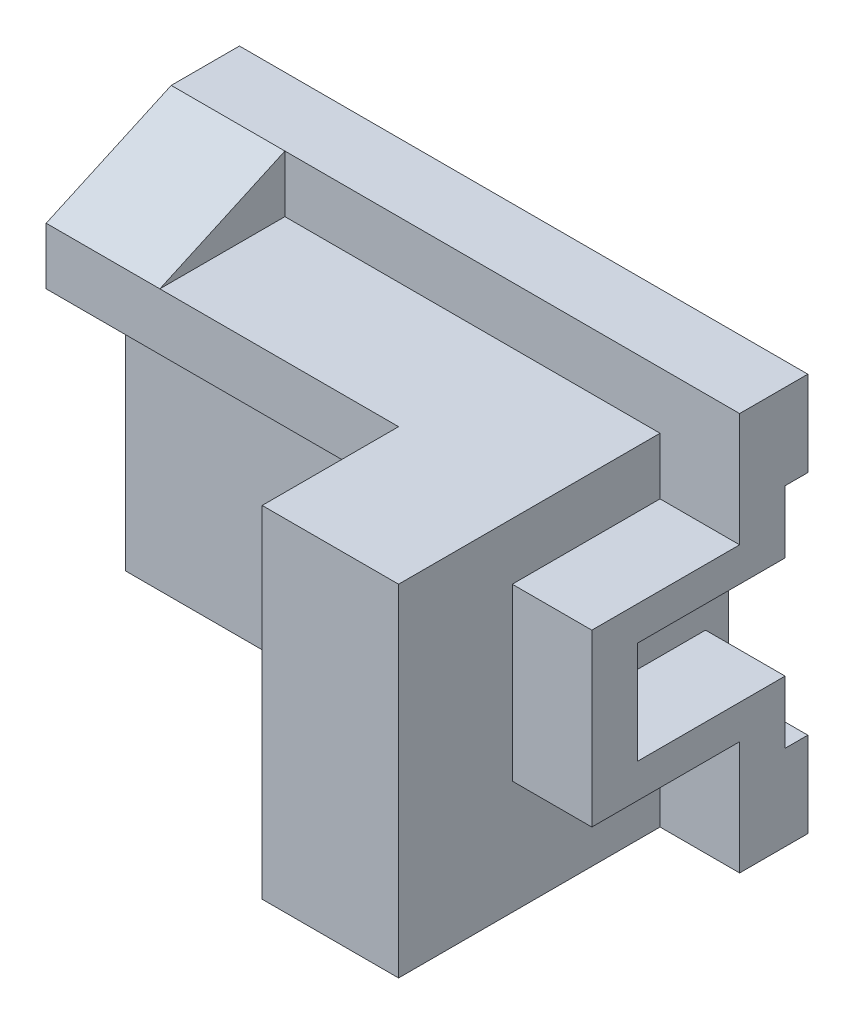
ISO-10303-21;
HEADER;
FILE_DESCRIPTION(('STEP AP214'),'2;1');
FILE_NAME('part.step','',(''),(''),'','','');
FILE_SCHEMA(('AUTOMOTIVE_DESIGN { 1 0 10303 214 1 1 1 1 }'));
ENDSEC;
DATA;
#1=APPLICATION_CONTEXT('core data for automotive mechanical design processes');
#2=APPLICATION_PROTOCOL_DEFINITION('international standard','automotive_design',2000,#1);
#3=PRODUCT_CONTEXT('',#1,'mechanical');
#4=PRODUCT('Part','Part','',(#3));
#5=PRODUCT_RELATED_PRODUCT_CATEGORY('part','',(#4));
#6=PRODUCT_DEFINITION_FORMATION('','',#4);
#7=PRODUCT_DEFINITION_CONTEXT('part definition',#1,'design');
#8=PRODUCT_DEFINITION('design','',#6,#7);
#9=PRODUCT_DEFINITION_SHAPE('','',#8);
#10=(LENGTH_UNIT() NAMED_UNIT(*) SI_UNIT(.MILLI.,.METRE.));
#11=(NAMED_UNIT(*) PLANE_ANGLE_UNIT() SI_UNIT($,.RADIAN.));
#12=(NAMED_UNIT(*) SI_UNIT($,.STERADIAN.) SOLID_ANGLE_UNIT());
#13=UNCERTAINTY_MEASURE_WITH_UNIT(LENGTH_MEASURE(1.E-05),#10,'distance_accuracy_value','');
#14=(GEOMETRIC_REPRESENTATION_CONTEXT(3) GLOBAL_UNCERTAINTY_ASSIGNED_CONTEXT((#13)) GLOBAL_UNIT_ASSIGNED_CONTEXT((#10,
#11,#12)) REPRESENTATION_CONTEXT('',''));
#15=CARTESIAN_POINT('',(0.,0.,0.));
#16=DIRECTION('',(0.,0.,1.));
#17=DIRECTION('',(1.,0.,0.));
#18=AXIS2_PLACEMENT_3D('',#15,#16,#17);
#19=CARTESIAN_POINT('',(20.8660687473185,17.5,6.));
#20=DIRECTION('',(0.,0.910366477462605,0.413802944301184));
#21=DIRECTION('',(0.,-0.413802944301184,0.910366477462605));
#22=AXIS2_PLACEMENT_3D('',#19,#20,#21);
#23=PLANE('',#22);
#24=DIRECTION('',(-1.,0.,0.));
#25=VECTOR('',#24,1.);
#26=CARTESIAN_POINT('',(20.8660687473185,12.5,17.));
#27=LINE('',#26,#25);
#28=CARTESIAN_POINT('',(-15.,12.5,17.));
#29=VERTEX_POINT('',#28);
#30=CARTESIAN_POINT('',(-25.,12.5,17.));
#31=VERTEX_POINT('',#30);
#32=EDGE_CURVE('E235',#29,#31,#27,.T.);
#33=ORIENTED_EDGE('',*,*,#32,.F.);
#34=DIRECTION('',(0.,0.413802944301184,-0.910366477462605));
#35=VECTOR('',#34,1.);
#36=CARTESIAN_POINT('',(-15.,17.5,6.));
#37=LINE('',#36,#35);
#38=CARTESIAN_POINT('',(-15.,17.5,6.));
#39=VERTEX_POINT('',#38);
#40=EDGE_CURVE('E13',#29,#39,#37,.T.);
#41=ORIENTED_EDGE('',*,*,#40,.T.);
#42=DIRECTION('',(-1.,0.,0.));
#43=VECTOR('',#42,1.);
#44=CARTESIAN_POINT('',(20.8660687473185,17.5,6.));
#45=LINE('',#44,#43);
#46=CARTESIAN_POINT('',(-25.,17.5,6.));
#47=VERTEX_POINT('',#46);
#48=EDGE_CURVE('E236',#39,#47,#45,.T.);
#49=ORIENTED_EDGE('',*,*,#48,.T.);
#50=DIRECTION('',(0.,0.413802944301184,-0.910366477462605));
#51=VECTOR('',#50,1.);
#52=CARTESIAN_POINT('',(-25.,17.5,6.));
#53=LINE('',#52,#51);
#54=EDGE_CURVE('E226',#31,#47,#53,.T.);
#55=ORIENTED_EDGE('',*,*,#54,.F.);
#56=EDGE_LOOP('',(#33,#41,#49,#55));
#57=FACE_BOUND('',#56,.T.);
#58=ADVANCED_FACE('F37',(#57),#23,.T.);
#59=CARTESIAN_POINT('',(0.,0.,6.));
#60=DIRECTION('',(0.,0.,-1.));
#61=DIRECTION('',(-1.,0.,0.));
#62=AXIS2_PLACEMENT_3D('',#59,#60,#61);
#63=PLANE('',#62);
#64=DIRECTION('',(-1.,0.,0.));
#65=VECTOR('',#64,1.);
#66=CARTESIAN_POINT('',(-25.,17.5,6.));
#67=LINE('',#66,#65);
#68=CARTESIAN_POINT('',(25.,17.5,6.));
#69=VERTEX_POINT('',#68);
#70=EDGE_CURVE('E354',#69,#39,#67,.T.);
#71=ORIENTED_EDGE('',*,*,#70,.T.);
#72=DIRECTION('',(0.,-1.,0.));
#73=VECTOR('',#72,1.);
#74=CARTESIAN_POINT('',(-15.,12.5,6.));
#75=LINE('',#74,#73);
#76=CARTESIAN_POINT('',(-15.,12.5,6.));
#77=VERTEX_POINT('',#76);
#78=EDGE_CURVE('E206',#39,#77,#75,.T.);
#79=ORIENTED_EDGE('',*,*,#78,.T.);
#80=DIRECTION('',(-1.,0.,0.));
#81=VECTOR('',#80,1.);
#82=CARTESIAN_POINT('',(18.,12.5,6.));
#83=LINE('',#82,#81);
#84=CARTESIAN_POINT('',(18.,12.5,6.));
#85=VERTEX_POINT('',#84);
#86=EDGE_CURVE('E335',#85,#77,#83,.T.);
#87=ORIENTED_EDGE('',*,*,#86,.F.);
#88=DIRECTION('',(0.,1.,0.));
#89=VECTOR('',#88,1.);
#90=CARTESIAN_POINT('',(18.,-17.5,6.));
#91=LINE('',#90,#89);
#92=CARTESIAN_POINT('',(18.,7.5,6.));
#93=VERTEX_POINT('',#92);
#94=EDGE_CURVE('E309',#93,#85,#91,.T.);
#95=ORIENTED_EDGE('',*,*,#94,.F.);
#96=DIRECTION('',(-1.,0.,0.));
#97=VECTOR('',#96,1.);
#98=CARTESIAN_POINT('',(44.8494332412792,7.5,6.));
#99=LINE('',#98,#97);
#100=CARTESIAN_POINT('',(25.,7.5,6.));
#101=VERTEX_POINT('',#100);
#102=EDGE_CURVE('E321',#101,#93,#99,.T.);
#103=ORIENTED_EDGE('',*,*,#102,.F.);
#104=DIRECTION('',(0.,1.,0.));
#105=VECTOR('',#104,1.);
#106=CARTESIAN_POINT('',(25.,-17.5,6.));
#107=LINE('',#106,#105);
#108=EDGE_CURVE('E355',#101,#69,#107,.T.);
#109=ORIENTED_EDGE('',*,*,#108,.T.);
#110=EDGE_LOOP('',(#71,#79,#87,#95,#103,#109));
#111=FACE_BOUND('',#110,.T.);
#112=ADVANCED_FACE('F405',(#111),#63,.F.);
#113=DIRECTION('',(-1.,0.,0.));
#114=VECTOR('',#113,1.);
#115=CARTESIAN_POINT('',(44.8494332412792,-7.5,6.));
#116=LINE('',#115,#114);
#117=CARTESIAN_POINT('',(25.,-7.5,6.));
#118=VERTEX_POINT('',#117);
#119=CARTESIAN_POINT('',(18.,-7.5,6.));
#120=VERTEX_POINT('',#119);
#121=EDGE_CURVE('E324',#118,#120,#116,.T.);
#122=ORIENTED_EDGE('',*,*,#121,.T.);
#123=CARTESIAN_POINT('',(18.,-17.5,6.));
#124=VERTEX_POINT('',#123);
#125=EDGE_CURVE('E343',#124,#120,#91,.T.);
#126=ORIENTED_EDGE('',*,*,#125,.F.);
#127=DIRECTION('',(1.,0.,0.));
#128=VECTOR('',#127,1.);
#129=CARTESIAN_POINT('',(-25.,-17.5,6.));
#130=LINE('',#129,#128);
#131=CARTESIAN_POINT('',(25.,-17.5,6.));
#132=VERTEX_POINT('',#131);
#133=EDGE_CURVE('E357',#124,#132,#130,.T.);
#134=ORIENTED_EDGE('',*,*,#133,.T.);
#135=EDGE_CURVE('E352',#132,#118,#107,.T.);
#136=ORIENTED_EDGE('',*,*,#135,.T.);
#137=EDGE_LOOP('',(#122,#126,#134,#136));
#138=FACE_BOUND('',#137,.T.);
#139=ADVANCED_FACE('F391',(#138),#63,.F.);
#140=CARTESIAN_POINT('',(18.,-17.5,29.));
#141=DIRECTION('',(-1.,0.,0.));
#142=DIRECTION('',(0.,0.,1.));
#143=AXIS2_PLACEMENT_3D('',#140,#141,#142);
#144=PLANE('',#143);
#145=DIRECTION('',(0.,0.,1.));
#146=VECTOR('',#145,1.);
#147=CARTESIAN_POINT('',(18.,7.5,6.));
#148=LINE('',#147,#146);
#149=CARTESIAN_POINT('',(18.,7.5,19.));
#150=VERTEX_POINT('',#149);
#151=EDGE_CURVE('E315',#93,#150,#148,.T.);
#152=ORIENTED_EDGE('',*,*,#151,.F.);
#153=ORIENTED_EDGE('',*,*,#94,.T.);
#154=DIRECTION('',(0.,0.,-1.));
#155=VECTOR('',#154,1.);
#156=CARTESIAN_POINT('',(18.,12.5,29.));
#157=LINE('',#156,#155);
#158=CARTESIAN_POINT('',(18.,12.5,29.));
#159=VERTEX_POINT('',#158);
#160=EDGE_CURVE('E347',#159,#85,#157,.T.);
#161=ORIENTED_EDGE('',*,*,#160,.F.);
#162=DIRECTION('',(0.,1.,0.));
#163=VECTOR('',#162,1.);
#164=CARTESIAN_POINT('',(18.,-17.5,29.));
#165=LINE('',#164,#163);
#166=CARTESIAN_POINT('',(18.,-17.5,29.));
#167=VERTEX_POINT('',#166);
#168=EDGE_CURVE('E331',#167,#159,#165,.T.);
#169=ORIENTED_EDGE('',*,*,#168,.F.);
#170=DIRECTION('',(0.,0.,-1.));
#171=VECTOR('',#170,1.);
#172=CARTESIAN_POINT('',(18.,-17.5,29.));
#173=LINE('',#172,#171);
#174=EDGE_CURVE('E341',#167,#124,#173,.T.);
#175=ORIENTED_EDGE('',*,*,#174,.T.);
#176=ORIENTED_EDGE('',*,*,#125,.T.);
#177=DIRECTION('',(0.,0.,-1.));
#178=VECTOR('',#177,1.);
#179=CARTESIAN_POINT('',(18.,-7.5,6.));
#180=LINE('',#179,#178);
#181=CARTESIAN_POINT('',(18.,-7.5,19.));
#182=VERTEX_POINT('',#181);
#183=EDGE_CURVE('E312',#182,#120,#180,.T.);
#184=ORIENTED_EDGE('',*,*,#183,.F.);
#185=DIRECTION('',(0.,-1.,0.));
#186=VECTOR('',#185,1.);
#187=CARTESIAN_POINT('',(18.,-7.5,19.));
#188=LINE('',#187,#186);
#189=EDGE_CURVE('E274',#150,#182,#188,.T.);
#190=ORIENTED_EDGE('',*,*,#189,.F.);
#191=EDGE_LOOP('',(#152,#153,#161,#169,#175,#176,#184,#190));
#192=FACE_BOUND('',#191,.T.);
#193=ADVANCED_FACE('F383',(#192),#144,.F.);
#194=CARTESIAN_POINT('',(25.,-17.5,6.));
#195=DIRECTION('',(-1.,0.,0.));
#196=DIRECTION('',(0.,0.,1.));
#197=AXIS2_PLACEMENT_3D('',#194,#195,#196);
#198=PLANE('',#197);
#199=DIRECTION('',(0.,1.,0.));
#200=VECTOR('',#199,1.);
#201=CARTESIAN_POINT('',(25.,0.,2.));
#202=LINE('',#201,#200);
#203=CARTESIAN_POINT('',(25.,4.5,2.));
#204=VERTEX_POINT('',#203);
#205=CARTESIAN_POINT('',(25.,10.,2.));
#206=VERTEX_POINT('',#205);
#207=EDGE_CURVE('E253',#204,#206,#202,.T.);
#208=ORIENTED_EDGE('',*,*,#207,.T.);
#209=DIRECTION('',(0.,0.,1.));
#210=VECTOR('',#209,1.);
#211=CARTESIAN_POINT('',(25.,10.,0.));
#212=LINE('',#211,#210);
#213=CARTESIAN_POINT('',(25.,10.,0.));
#214=VERTEX_POINT('',#213);
#215=EDGE_CURVE('E252',#214,#206,#212,.T.);
#216=ORIENTED_EDGE('',*,*,#215,.F.);
#217=DIRECTION('',(0.,1.,0.));
#218=VECTOR('',#217,1.);
#219=CARTESIAN_POINT('',(25.,-17.5,0.));
#220=LINE('',#219,#218);
#221=CARTESIAN_POINT('',(25.,17.5,0.));
#222=VERTEX_POINT('',#221);
#223=EDGE_CURVE('E351',#214,#222,#220,.T.);
#224=ORIENTED_EDGE('',*,*,#223,.T.);
#225=DIRECTION('',(0.,0.,-1.));
#226=VECTOR('',#225,1.);
#227=CARTESIAN_POINT('',(25.,17.5,6.));
#228=LINE('',#227,#226);
#229=EDGE_CURVE('E45',#69,#222,#228,.T.);
#230=ORIENTED_EDGE('',*,*,#229,.F.);
#231=ORIENTED_EDGE('',*,*,#108,.F.);
#232=DIRECTION('',(0.,0.,-1.));
#233=VECTOR('',#232,1.);
#234=CARTESIAN_POINT('',(25.,7.5,6.));
#235=LINE('',#234,#233);
#236=CARTESIAN_POINT('',(25.,7.5,19.));
#237=VERTEX_POINT('',#236);
#238=EDGE_CURVE('E306',#237,#101,#235,.T.);
#239=ORIENTED_EDGE('',*,*,#238,.F.);
#240=DIRECTION('',(0.,1.,0.));
#241=VECTOR('',#240,1.);
#242=CARTESIAN_POINT('',(25.,-7.5,19.));
#243=LINE('',#242,#241);
#244=CARTESIAN_POINT('',(25.,-7.5,19.));
#245=VERTEX_POINT('',#244);
#246=EDGE_CURVE('E305',#245,#237,#243,.T.);
#247=ORIENTED_EDGE('',*,*,#246,.F.);
#248=DIRECTION('',(0.,0.,1.));
#249=VECTOR('',#248,1.);
#250=CARTESIAN_POINT('',(25.,-7.5,6.));
#251=LINE('',#250,#249);
#252=EDGE_CURVE('E302',#118,#245,#251,.T.);
#253=ORIENTED_EDGE('',*,*,#252,.F.);
#254=ORIENTED_EDGE('',*,*,#135,.F.);
#255=DIRECTION('',(0.,0.,-1.));
#256=VECTOR('',#255,1.);
#257=CARTESIAN_POINT('',(25.,-17.5,6.));
#258=LINE('',#257,#256);
#259=CARTESIAN_POINT('',(25.,-17.5,0.));
#260=VERTEX_POINT('',#259);
#261=EDGE_CURVE('E365',#132,#260,#258,.T.);
#262=ORIENTED_EDGE('',*,*,#261,.T.);
#263=CARTESIAN_POINT('',(25.,-10.,0.));
#264=VERTEX_POINT('',#263);
#265=EDGE_CURVE('E360',#260,#264,#220,.T.);
#266=ORIENTED_EDGE('',*,*,#265,.T.);
#267=DIRECTION('',(0.,0.,1.));
#268=VECTOR('',#267,1.);
#269=CARTESIAN_POINT('',(25.,-10.,0.));
#270=LINE('',#269,#268);
#271=CARTESIAN_POINT('',(25.,-10.,2.));
#272=VERTEX_POINT('',#271);
#273=EDGE_CURVE('E261',#264,#272,#270,.T.);
#274=ORIENTED_EDGE('',*,*,#273,.T.);
#275=DIRECTION('',(0.,1.,0.));
#276=VECTOR('',#275,1.);
#277=CARTESIAN_POINT('',(25.,0.,2.));
#278=LINE('',#277,#276);
#279=CARTESIAN_POINT('',(25.,-4.5,2.));
#280=VERTEX_POINT('',#279);
#281=EDGE_CURVE('E260',#272,#280,#278,.T.);
#282=ORIENTED_EDGE('',*,*,#281,.T.);
#283=DIRECTION('',(0.,0.,1.));
#284=VECTOR('',#283,1.);
#285=CARTESIAN_POINT('',(25.,-4.5,0.));
#286=LINE('',#285,#284);
#287=CARTESIAN_POINT('',(25.,-4.5,15.));
#288=VERTEX_POINT('',#287);
#289=EDGE_CURVE('E268',#280,#288,#286,.T.);
#290=ORIENTED_EDGE('',*,*,#289,.T.);
#291=DIRECTION('',(0.,1.,0.));
#292=VECTOR('',#291,1.);
#293=CARTESIAN_POINT('',(25.,0.,15.));
#294=LINE('',#293,#292);
#295=CARTESIAN_POINT('',(25.,4.5,15.));
#296=VERTEX_POINT('',#295);
#297=EDGE_CURVE('E243',#288,#296,#294,.T.);
#298=ORIENTED_EDGE('',*,*,#297,.T.);
#299=DIRECTION('',(0.,0.,1.));
#300=VECTOR('',#299,1.);
#301=CARTESIAN_POINT('',(25.,4.5,0.));
#302=LINE('',#301,#300);
#303=EDGE_CURVE('E248',#204,#296,#302,.T.);
#304=ORIENTED_EDGE('',*,*,#303,.F.);
#305=EDGE_LOOP('',(#208,#216,#224,#230,#231,#239,#247,#253,#254,#262,#266,#274,#282,#290,#298,#304));
#306=FACE_BOUND('',#305,.T.);
#307=ADVANCED_FACE('F39',(#306),#198,.F.);
#308=CARTESIAN_POINT('',(-25.,17.5,6.));
#309=DIRECTION('',(0.,-1.,0.));
#310=DIRECTION('',(0.,0.,-1.));
#311=AXIS2_PLACEMENT_3D('',#308,#309,#310);
#312=PLANE('',#311);
#313=DIRECTION('',(-1.,0.,0.));
#314=VECTOR('',#313,1.);
#315=CARTESIAN_POINT('',(-25.,17.5,0.));
#316=LINE('',#315,#314);
#317=CARTESIAN_POINT('',(-25.,17.5,0.));
#318=VERTEX_POINT('',#317);
#319=EDGE_CURVE('E415',#222,#318,#316,.T.);
#320=ORIENTED_EDGE('',*,*,#319,.T.);
#321=DIRECTION('',(0.,0.,-1.));
#322=VECTOR('',#321,1.);
#323=CARTESIAN_POINT('',(-25.,17.5,6.));
#324=LINE('',#323,#322);
#325=EDGE_CURVE('E419',#47,#318,#324,.T.);
#326=ORIENTED_EDGE('',*,*,#325,.F.);
#327=ORIENTED_EDGE('',*,*,#48,.F.);
#328=ORIENTED_EDGE('',*,*,#70,.F.);
#329=ORIENTED_EDGE('',*,*,#229,.T.);
#330=EDGE_LOOP('',(#320,#326,#327,#328,#329));
#331=FACE_BOUND('',#330,.T.);
#332=ADVANCED_FACE('F424',(#331),#312,.F.);
#333=CARTESIAN_POINT('',(-25.,-17.5,6.));
#334=DIRECTION('',(1.,0.,0.));
#335=DIRECTION('',(0.,0.,-1.));
#336=AXIS2_PLACEMENT_3D('',#333,#334,#335);
#337=PLANE('',#336);
#338=DIRECTION('',(0.,0.,-1.));
#339=VECTOR('',#338,1.);
#340=CARTESIAN_POINT('',(-25.,-17.5,6.));
#341=LINE('',#340,#339);
#342=CARTESIAN_POINT('',(-25.,-17.5,10.));
#343=VERTEX_POINT('',#342);
#344=CARTESIAN_POINT('',(-25.,-17.5,0.));
#345=VERTEX_POINT('',#344);
#346=EDGE_CURVE('E217',#343,#345,#341,.T.);
#347=ORIENTED_EDGE('',*,*,#346,.F.);
#348=DIRECTION('',(0.,-1.,0.));
#349=VECTOR('',#348,1.);
#350=CARTESIAN_POINT('',(-25.,7.5,10.));
#351=LINE('',#350,#349);
#352=CARTESIAN_POINT('',(-25.,7.5,10.));
#353=VERTEX_POINT('',#352);
#354=EDGE_CURVE('E212',#353,#343,#351,.T.);
#355=ORIENTED_EDGE('',*,*,#354,.F.);
#356=DIRECTION('',(0.,0.,1.));
#357=VECTOR('',#356,1.);
#358=CARTESIAN_POINT('',(-25.,7.5,17.));
#359=LINE('',#358,#357);
#360=CARTESIAN_POINT('',(-25.,7.5,17.));
#361=VERTEX_POINT('',#360);
#362=EDGE_CURVE('E197',#353,#361,#359,.T.);
#363=ORIENTED_EDGE('',*,*,#362,.T.);
#364=DIRECTION('',(0.,1.,0.));
#365=VECTOR('',#364,1.);
#366=CARTESIAN_POINT('',(-25.,12.5,17.));
#367=LINE('',#366,#365);
#368=EDGE_CURVE('E205',#361,#31,#367,.T.);
#369=ORIENTED_EDGE('',*,*,#368,.T.);
#370=ORIENTED_EDGE('',*,*,#54,.T.);
#371=ORIENTED_EDGE('',*,*,#325,.T.);
#372=DIRECTION('',(0.,-1.,0.));
#373=VECTOR('',#372,1.);
#374=CARTESIAN_POINT('',(-25.,-17.5,0.));
#375=LINE('',#374,#373);
#376=EDGE_CURVE('E412',#318,#345,#375,.T.);
#377=ORIENTED_EDGE('',*,*,#376,.T.);
#378=EDGE_LOOP('',(#347,#355,#363,#369,#370,#371,#377));
#379=FACE_BOUND('',#378,.T.);
#380=ADVANCED_FACE('F215',(#379),#337,.F.);
#381=CARTESIAN_POINT('',(-25.,-17.5,6.));
#382=DIRECTION('',(0.,1.,0.));
#383=DIRECTION('',(0.,0.,1.));
#384=AXIS2_PLACEMENT_3D('',#381,#382,#383);
#385=PLANE('',#384);
#386=DIRECTION('',(1.,0.,0.));
#387=VECTOR('',#386,1.);
#388=CARTESIAN_POINT('',(-25.,-17.5,0.));
#389=LINE('',#388,#387);
#390=EDGE_CURVE('E411',#345,#260,#389,.T.);
#391=ORIENTED_EDGE('',*,*,#390,.T.);
#392=ORIENTED_EDGE('',*,*,#261,.F.);
#393=ORIENTED_EDGE('',*,*,#133,.F.);
#394=ORIENTED_EDGE('',*,*,#174,.F.);
#395=DIRECTION('',(1.,0.,0.));
#396=VECTOR('',#395,1.);
#397=CARTESIAN_POINT('',(18.,-17.5,29.));
#398=LINE('',#397,#396);
#399=CARTESIAN_POINT('',(6.00000000000001,-17.5,29.));
#400=VERTEX_POINT('',#399);
#401=EDGE_CURVE('E339',#400,#167,#398,.T.);
#402=ORIENTED_EDGE('',*,*,#401,.F.);
#403=DIRECTION('',(0.,0.,-1.));
#404=VECTOR('',#403,1.);
#405=CARTESIAN_POINT('',(6.00000000000001,-17.5,29.));
#406=LINE('',#405,#404);
#407=CARTESIAN_POINT('',(6.00000000000001,-17.5,10.));
#408=VERTEX_POINT('',#407);
#409=EDGE_CURVE('E348',#400,#408,#406,.T.);
#410=ORIENTED_EDGE('',*,*,#409,.T.);
#411=DIRECTION('',(1.,0.,0.));
#412=VECTOR('',#411,1.);
#413=CARTESIAN_POINT('',(-25.,-17.5,10.));
#414=LINE('',#413,#412);
#415=EDGE_CURVE('E716',#343,#408,#414,.T.);
#416=ORIENTED_EDGE('',*,*,#415,.F.);
#417=ORIENTED_EDGE('',*,*,#346,.T.);
#418=EDGE_LOOP('',(#391,#392,#393,#394,#402,#410,#416,#417));
#419=FACE_BOUND('',#418,.T.);
#420=ADVANCED_FACE('F386',(#419),#385,.F.);
#421=CARTESIAN_POINT('',(0.,0.,0.));
#422=DIRECTION('',(0.,0.,-1.));
#423=DIRECTION('',(-1.,0.,0.));
#424=AXIS2_PLACEMENT_3D('',#421,#422,#423);
#425=PLANE('',#424);
#426=DIRECTION('',(1.,0.,0.));
#427=VECTOR('',#426,1.);
#428=CARTESIAN_POINT('',(-7.,10.,0.));
#429=LINE('',#428,#427);
#430=CARTESIAN_POINT('',(18.,10.,0.));
#431=VERTEX_POINT('',#430);
#432=EDGE_CURVE('E278',#431,#214,#429,.T.);
#433=ORIENTED_EDGE('',*,*,#432,.F.);
#434=DIRECTION('',(0.,1.,0.));
#435=VECTOR('',#434,1.);
#436=CARTESIAN_POINT('',(18.,0.,0.));
#437=LINE('',#436,#435);
#438=CARTESIAN_POINT('',(18.,-10.,0.));
#439=VERTEX_POINT('',#438);
#440=EDGE_CURVE('E276',#439,#431,#437,.T.);
#441=ORIENTED_EDGE('',*,*,#440,.F.);
#442=DIRECTION('',(1.,0.,0.));
#443=VECTOR('',#442,1.);
#444=CARTESIAN_POINT('',(-7.,-10.,0.));
#445=LINE('',#444,#443);
#446=EDGE_CURVE('E265',#439,#264,#445,.T.);
#447=ORIENTED_EDGE('',*,*,#446,.T.);
#448=ORIENTED_EDGE('',*,*,#265,.F.);
#449=ORIENTED_EDGE('',*,*,#390,.F.);
#450=ORIENTED_EDGE('',*,*,#376,.F.);
#451=ORIENTED_EDGE('',*,*,#319,.F.);
#452=ORIENTED_EDGE('',*,*,#223,.F.);
#453=EDGE_LOOP('',(#433,#441,#447,#448,#449,#450,#451,#452));
#454=FACE_BOUND('',#453,.T.);
#455=ADVANCED_FACE('F451',(#454),#425,.T.);
#456=CARTESIAN_POINT('',(18.,12.5,29.));
#457=DIRECTION('',(0.,-1.,0.));
#458=DIRECTION('',(1.,0.,0.));
#459=AXIS2_PLACEMENT_3D('',#456,#457,#458);
#460=PLANE('',#459);
#461=ORIENTED_EDGE('',*,*,#86,.T.);
#462=DIRECTION('',(0.,0.,1.));
#463=VECTOR('',#462,1.);
#464=CARTESIAN_POINT('',(-15.,12.5,6.));
#465=LINE('',#464,#463);
#466=EDGE_CURVE('E218',#77,#29,#465,.T.);
#467=ORIENTED_EDGE('',*,*,#466,.T.);
#468=CARTESIAN_POINT('',(6.00000000000001,12.5,17.));
#469=VERTEX_POINT('',#468);
#470=EDGE_CURVE('E239',#469,#29,#27,.T.);
#471=ORIENTED_EDGE('',*,*,#470,.F.);
#472=DIRECTION('',(0.,0.,-1.));
#473=VECTOR('',#472,1.);
#474=CARTESIAN_POINT('',(6.00000000000001,12.5,29.));
#475=LINE('',#474,#473);
#476=CARTESIAN_POINT('',(6.00000000000001,12.5,29.));
#477=VERTEX_POINT('',#476);
#478=EDGE_CURVE('E344',#477,#469,#475,.T.);
#479=ORIENTED_EDGE('',*,*,#478,.F.);
#480=DIRECTION('',(-1.,0.,0.));
#481=VECTOR('',#480,1.);
#482=CARTESIAN_POINT('',(18.,12.5,29.));
#483=LINE('',#482,#481);
#484=EDGE_CURVE('E334',#159,#477,#483,.T.);
#485=ORIENTED_EDGE('',*,*,#484,.F.);
#486=ORIENTED_EDGE('',*,*,#160,.T.);
#487=EDGE_LOOP('',(#461,#467,#471,#479,#485,#486));
#488=FACE_BOUND('',#487,.T.);
#489=ADVANCED_FACE('F439',(#488),#460,.F.);
#490=CARTESIAN_POINT('',(6.00000000000001,-17.5,29.));
#491=DIRECTION('',(1.,0.,0.));
#492=DIRECTION('',(0.,0.,-1.));
#493=AXIS2_PLACEMENT_3D('',#490,#491,#492);
#494=PLANE('',#493);
#495=DIRECTION('',(0.,0.,1.));
#496=VECTOR('',#495,1.);
#497=CARTESIAN_POINT('',(6.00000000000001,7.5,17.));
#498=LINE('',#497,#496);
#499=CARTESIAN_POINT('',(6.00000000000001,7.5,10.));
#500=VERTEX_POINT('',#499);
#501=CARTESIAN_POINT('',(6.00000000000001,7.50000000000001,17.));
#502=VERTEX_POINT('',#501);
#503=EDGE_CURVE('E229',#500,#502,#498,.T.);
#504=ORIENTED_EDGE('',*,*,#503,.F.);
#505=DIRECTION('',(0.,1.,0.));
#506=VECTOR('',#505,1.);
#507=CARTESIAN_POINT('',(6.00000000000001,-17.5,10.));
#508=LINE('',#507,#506);
#509=EDGE_CURVE('E52',#408,#500,#508,.T.);
#510=ORIENTED_EDGE('',*,*,#509,.F.);
#511=ORIENTED_EDGE('',*,*,#409,.F.);
#512=DIRECTION('',(0.,-1.,0.));
#513=VECTOR('',#512,1.);
#514=CARTESIAN_POINT('',(6.00000000000001,-17.5,29.));
#515=LINE('',#514,#513);
#516=EDGE_CURVE('E337',#477,#400,#515,.T.);
#517=ORIENTED_EDGE('',*,*,#516,.F.);
#518=ORIENTED_EDGE('',*,*,#478,.T.);
#519=DIRECTION('',(0.,1.,0.));
#520=VECTOR('',#519,1.);
#521=CARTESIAN_POINT('',(6.00000000000001,12.5,17.));
#522=LINE('',#521,#520);
#523=EDGE_CURVE('E232',#502,#469,#522,.T.);
#524=ORIENTED_EDGE('',*,*,#523,.F.);
#525=EDGE_LOOP('',(#504,#510,#511,#517,#518,#524));
#526=FACE_BOUND('',#525,.T.);
#527=ADVANCED_FACE('F443',(#526),#494,.F.);
#528=CARTESIAN_POINT('',(0.,0.,29.));
#529=DIRECTION('',(0.,0.,1.));
#530=DIRECTION('',(1.,0.,0.));
#531=AXIS2_PLACEMENT_3D('',#528,#529,#530);
#532=PLANE('',#531);
#533=ORIENTED_EDGE('',*,*,#168,.T.);
#534=ORIENTED_EDGE('',*,*,#484,.T.);
#535=ORIENTED_EDGE('',*,*,#516,.T.);
#536=ORIENTED_EDGE('',*,*,#401,.T.);
#537=EDGE_LOOP('',(#533,#534,#535,#536));
#538=FACE_BOUND('',#537,.T.);
#539=ADVANCED_FACE('F442',(#538),#532,.T.);
#540=CARTESIAN_POINT('',(44.8494332412792,7.5,6.));
#541=DIRECTION('',(0.,-1.,0.));
#542=DIRECTION('',(0.,0.,-1.));
#543=AXIS2_PLACEMENT_3D('',#540,#541,#542);
#544=PLANE('',#543);
#545=DIRECTION('',(-1.,0.,0.));
#546=VECTOR('',#545,1.);
#547=CARTESIAN_POINT('',(44.8494332412792,7.5,19.));
#548=LINE('',#547,#546);
#549=EDGE_CURVE('E318',#237,#150,#548,.T.);
#550=ORIENTED_EDGE('',*,*,#549,.F.);
#551=ORIENTED_EDGE('',*,*,#238,.T.);
#552=ORIENTED_EDGE('',*,*,#102,.T.);
#553=ORIENTED_EDGE('',*,*,#151,.T.);
#554=EDGE_LOOP('',(#550,#551,#552,#553));
#555=FACE_BOUND('',#554,.T.);
#556=ADVANCED_FACE('F402',(#555),#544,.F.);
#557=CARTESIAN_POINT('',(44.8494332412792,-7.5,6.));
#558=DIRECTION('',(0.,1.,0.));
#559=DIRECTION('',(0.,0.,1.));
#560=AXIS2_PLACEMENT_3D('',#557,#558,#559);
#561=PLANE('',#560);
#562=ORIENTED_EDGE('',*,*,#121,.F.);
#563=ORIENTED_EDGE('',*,*,#252,.T.);
#564=DIRECTION('',(-1.,0.,0.));
#565=VECTOR('',#564,1.);
#566=CARTESIAN_POINT('',(44.8494332412792,-7.5,19.));
#567=LINE('',#566,#565);
#568=EDGE_CURVE('E326',#245,#182,#567,.T.);
#569=ORIENTED_EDGE('',*,*,#568,.T.);
#570=ORIENTED_EDGE('',*,*,#183,.T.);
#571=EDGE_LOOP('',(#562,#563,#569,#570));
#572=FACE_BOUND('',#571,.T.);
#573=ADVANCED_FACE('F395',(#572),#561,.F.);
#574=CARTESIAN_POINT('',(44.8494332412792,-7.5,19.));
#575=DIRECTION('',(0.,0.,-1.));
#576=DIRECTION('',(0.,1.,0.));
#577=AXIS2_PLACEMENT_3D('',#574,#575,#576);
#578=PLANE('',#577);
#579=ORIENTED_EDGE('',*,*,#568,.F.);
#580=ORIENTED_EDGE('',*,*,#246,.T.);
#581=ORIENTED_EDGE('',*,*,#549,.T.);
#582=ORIENTED_EDGE('',*,*,#189,.T.);
#583=EDGE_LOOP('',(#579,#580,#581,#582));
#584=FACE_BOUND('',#583,.T.);
#585=ADVANCED_FACE('F400',(#584),#578,.F.);
#586=CARTESIAN_POINT('',(-7.,-4.5,0.));
#587=DIRECTION('',(0.,1.,0.));
#588=DIRECTION('',(0.,0.,1.));
#589=AXIS2_PLACEMENT_3D('',#586,#587,#588);
#590=PLANE('',#589);
#591=DIRECTION('',(0.,0.,1.));
#592=VECTOR('',#591,1.);
#593=CARTESIAN_POINT('',(18.,-4.5,0.));
#594=LINE('',#593,#592);
#595=CARTESIAN_POINT('',(18.,-4.5,2.));
#596=VERTEX_POINT('',#595);
#597=CARTESIAN_POINT('',(18.,-4.5,15.));
#598=VERTEX_POINT('',#597);
#599=EDGE_CURVE('E288',#596,#598,#594,.T.);
#600=ORIENTED_EDGE('',*,*,#599,.T.);
#601=DIRECTION('',(1.,0.,0.));
#602=VECTOR('',#601,1.);
#603=CARTESIAN_POINT('',(-7.,-4.5,15.));
#604=LINE('',#603,#602);
#605=EDGE_CURVE('E247',#598,#288,#604,.T.);
#606=ORIENTED_EDGE('',*,*,#605,.T.);
#607=ORIENTED_EDGE('',*,*,#289,.F.);
#608=DIRECTION('',(1.,0.,0.));
#609=VECTOR('',#608,1.);
#610=CARTESIAN_POINT('',(-7.,-4.5,2.));
#611=LINE('',#610,#609);
#612=EDGE_CURVE('E238',#596,#280,#611,.T.);
#613=ORIENTED_EDGE('',*,*,#612,.F.);
#614=EDGE_LOOP('',(#600,#606,#607,#613));
#615=FACE_BOUND('',#614,.T.);
#616=ADVANCED_FACE('F490',(#615),#590,.T.);
#617=CARTESIAN_POINT('',(-7.,0.,15.));
#618=DIRECTION('',(0.,0.,-1.));
#619=DIRECTION('',(-1.,0.,0.));
#620=AXIS2_PLACEMENT_3D('',#617,#618,#619);
#621=PLANE('',#620);
#622=DIRECTION('',(0.,1.,0.));
#623=VECTOR('',#622,1.);
#624=CARTESIAN_POINT('',(18.,0.,15.));
#625=LINE('',#624,#623);
#626=CARTESIAN_POINT('',(18.,4.5,15.));
#627=VERTEX_POINT('',#626);
#628=EDGE_CURVE('E283',#598,#627,#625,.T.);
#629=ORIENTED_EDGE('',*,*,#628,.T.);
#630=DIRECTION('',(1.,0.,0.));
#631=VECTOR('',#630,1.);
#632=CARTESIAN_POINT('',(-7.,4.5,15.));
#633=LINE('',#632,#631);
#634=EDGE_CURVE('E285',#627,#296,#633,.T.);
#635=ORIENTED_EDGE('',*,*,#634,.T.);
#636=ORIENTED_EDGE('',*,*,#297,.F.);
#637=ORIENTED_EDGE('',*,*,#605,.F.);
#638=EDGE_LOOP('',(#629,#635,#636,#637));
#639=FACE_BOUND('',#638,.T.);
#640=ADVANCED_FACE('F486',(#639),#621,.T.);
#641=CARTESIAN_POINT('',(-7.,4.5,0.));
#642=DIRECTION('',(0.,1.,0.));
#643=DIRECTION('',(0.,0.,1.));
#644=AXIS2_PLACEMENT_3D('',#641,#642,#643);
#645=PLANE('',#644);
#646=DIRECTION('',(1.,0.,0.));
#647=VECTOR('',#646,1.);
#648=CARTESIAN_POINT('',(-7.,4.5,2.));
#649=LINE('',#648,#647);
#650=CARTESIAN_POINT('',(18.,4.5,2.));
#651=VERTEX_POINT('',#650);
#652=EDGE_CURVE('E257',#651,#204,#649,.T.);
#653=ORIENTED_EDGE('',*,*,#652,.T.);
#654=ORIENTED_EDGE('',*,*,#303,.T.);
#655=ORIENTED_EDGE('',*,*,#634,.F.);
#656=DIRECTION('',(0.,0.,1.));
#657=VECTOR('',#656,1.);
#658=CARTESIAN_POINT('',(18.,4.5,0.));
#659=LINE('',#658,#657);
#660=EDGE_CURVE('E246',#651,#627,#659,.T.);
#661=ORIENTED_EDGE('',*,*,#660,.F.);
#662=EDGE_LOOP('',(#653,#654,#655,#661));
#663=FACE_BOUND('',#662,.T.);
#664=ADVANCED_FACE('F482',(#663),#645,.F.);
#665=CARTESIAN_POINT('',(-7.,0.,2.));
#666=DIRECTION('',(0.,0.,-1.));
#667=DIRECTION('',(0.,1.,0.));
#668=AXIS2_PLACEMENT_3D('',#665,#666,#667);
#669=PLANE('',#668);
#670=DIRECTION('',(0.,1.,0.));
#671=VECTOR('',#670,1.);
#672=CARTESIAN_POINT('',(18.,0.,2.));
#673=LINE('',#672,#671);
#674=CARTESIAN_POINT('',(18.,10.,2.));
#675=VERTEX_POINT('',#674);
#676=EDGE_CURVE('E275',#651,#675,#673,.T.);
#677=ORIENTED_EDGE('',*,*,#676,.T.);
#678=DIRECTION('',(1.,0.,0.));
#679=VECTOR('',#678,1.);
#680=CARTESIAN_POINT('',(-7.,10.,2.));
#681=LINE('',#680,#679);
#682=EDGE_CURVE('E279',#675,#206,#681,.T.);
#683=ORIENTED_EDGE('',*,*,#682,.T.);
#684=ORIENTED_EDGE('',*,*,#207,.F.);
#685=ORIENTED_EDGE('',*,*,#652,.F.);
#686=EDGE_LOOP('',(#677,#683,#684,#685));
#687=FACE_BOUND('',#686,.T.);
#688=ADVANCED_FACE('F478',(#687),#669,.T.);
#689=CARTESIAN_POINT('',(-7.,10.,0.));
#690=DIRECTION('',(0.,1.,0.));
#691=DIRECTION('',(0.,0.,1.));
#692=AXIS2_PLACEMENT_3D('',#689,#690,#691);
#693=PLANE('',#692);
#694=ORIENTED_EDGE('',*,*,#432,.T.);
#695=ORIENTED_EDGE('',*,*,#215,.T.);
#696=ORIENTED_EDGE('',*,*,#682,.F.);
#697=DIRECTION('',(0.,0.,1.));
#698=VECTOR('',#697,1.);
#699=CARTESIAN_POINT('',(18.,10.,0.));
#700=LINE('',#699,#698);
#701=EDGE_CURVE('E256',#431,#675,#700,.T.);
#702=ORIENTED_EDGE('',*,*,#701,.F.);
#703=EDGE_LOOP('',(#694,#695,#696,#702));
#704=FACE_BOUND('',#703,.T.);
#705=ADVANCED_FACE('F474',(#704),#693,.F.);
#706=CARTESIAN_POINT('',(-7.,-10.,0.));
#707=DIRECTION('',(0.,1.,0.));
#708=DIRECTION('',(0.,0.,1.));
#709=AXIS2_PLACEMENT_3D('',#706,#707,#708);
#710=PLANE('',#709);
#711=DIRECTION('',(0.,0.,1.));
#712=VECTOR('',#711,1.);
#713=CARTESIAN_POINT('',(18.,-10.,0.));
#714=LINE('',#713,#712);
#715=CARTESIAN_POINT('',(18.,-10.,2.));
#716=VERTEX_POINT('',#715);
#717=EDGE_CURVE('E271',#439,#716,#714,.T.);
#718=ORIENTED_EDGE('',*,*,#717,.T.);
#719=DIRECTION('',(1.,0.,0.));
#720=VECTOR('',#719,1.);
#721=CARTESIAN_POINT('',(-7.,-10.,2.));
#722=LINE('',#721,#720);
#723=EDGE_CURVE('E264',#716,#272,#722,.T.);
#724=ORIENTED_EDGE('',*,*,#723,.T.);
#725=ORIENTED_EDGE('',*,*,#273,.F.);
#726=ORIENTED_EDGE('',*,*,#446,.F.);
#727=EDGE_LOOP('',(#718,#724,#725,#726));
#728=FACE_BOUND('',#727,.T.);
#729=ADVANCED_FACE('F470',(#728),#710,.T.);
#730=CARTESIAN_POINT('',(-7.,0.,2.));
#731=DIRECTION('',(0.,0.,-1.));
#732=DIRECTION('',(0.,1.,0.));
#733=AXIS2_PLACEMENT_3D('',#730,#731,#732);
#734=PLANE('',#733);
#735=DIRECTION('',(0.,1.,0.));
#736=VECTOR('',#735,1.);
#737=CARTESIAN_POINT('',(18.,0.,2.));
#738=LINE('',#737,#736);
#739=EDGE_CURVE('E251',#716,#596,#738,.T.);
#740=ORIENTED_EDGE('',*,*,#739,.T.);
#741=ORIENTED_EDGE('',*,*,#612,.T.);
#742=ORIENTED_EDGE('',*,*,#281,.F.);
#743=ORIENTED_EDGE('',*,*,#723,.F.);
#744=EDGE_LOOP('',(#740,#741,#742,#743));
#745=FACE_BOUND('',#744,.T.);
#746=ADVANCED_FACE('F467',(#745),#734,.T.);
#747=CARTESIAN_POINT('',(18.,-17.5,29.));
#748=DIRECTION('',(-1.,0.,0.));
#749=DIRECTION('',(0.,0.,1.));
#750=AXIS2_PLACEMENT_3D('',#747,#748,#749);
#751=PLANE('',#750);
#752=ORIENTED_EDGE('',*,*,#739,.F.);
#753=ORIENTED_EDGE('',*,*,#717,.F.);
#754=ORIENTED_EDGE('',*,*,#440,.T.);
#755=ORIENTED_EDGE('',*,*,#701,.T.);
#756=ORIENTED_EDGE('',*,*,#676,.F.);
#757=ORIENTED_EDGE('',*,*,#660,.T.);
#758=ORIENTED_EDGE('',*,*,#628,.F.);
#759=ORIENTED_EDGE('',*,*,#599,.F.);
#760=EDGE_LOOP('',(#752,#753,#754,#755,#756,#757,#758,#759));
#761=FACE_BOUND('',#760,.T.);
#762=ADVANCED_FACE('F466',(#761),#751,.F.);
#763=CARTESIAN_POINT('',(20.8660687473185,7.5,17.));
#764=DIRECTION('',(0.,-1.,0.));
#765=DIRECTION('',(0.,0.,-1.));
#766=AXIS2_PLACEMENT_3D('',#763,#764,#765);
#767=PLANE('',#766);
#768=DIRECTION('',(-1.,0.,0.));
#769=VECTOR('',#768,1.);
#770=CARTESIAN_POINT('',(6.00000000000001,7.5,10.));
#771=LINE('',#770,#769);
#772=EDGE_CURVE('E60',#500,#353,#771,.T.);
#773=ORIENTED_EDGE('',*,*,#772,.F.);
#774=ORIENTED_EDGE('',*,*,#503,.T.);
#775=DIRECTION('',(-1.,0.,0.));
#776=VECTOR('',#775,1.);
#777=CARTESIAN_POINT('',(20.8660687473185,7.5,17.));
#778=LINE('',#777,#776);
#779=EDGE_CURVE('E200',#502,#361,#778,.T.);
#780=ORIENTED_EDGE('',*,*,#779,.T.);
#781=ORIENTED_EDGE('',*,*,#362,.F.);
#782=EDGE_LOOP('',(#773,#774,#780,#781));
#783=FACE_BOUND('',#782,.T.);
#784=ADVANCED_FACE('F198',(#783),#767,.T.);
#785=CARTESIAN_POINT('',(20.8660687473185,12.5,17.));
#786=DIRECTION('',(0.,0.,1.));
#787=DIRECTION('',(1.,0.,0.));
#788=AXIS2_PLACEMENT_3D('',#785,#786,#787);
#789=PLANE('',#788);
#790=ORIENTED_EDGE('',*,*,#779,.F.);
#791=ORIENTED_EDGE('',*,*,#523,.T.);
#792=ORIENTED_EDGE('',*,*,#470,.T.);
#793=ORIENTED_EDGE('',*,*,#32,.T.);
#794=ORIENTED_EDGE('',*,*,#368,.F.);
#795=EDGE_LOOP('',(#790,#791,#792,#793,#794));
#796=FACE_BOUND('',#795,.T.);
#797=ADVANCED_FACE('F435',(#796),#789,.T.);
#798=CARTESIAN_POINT('',(-15.,-17.5,6.));
#799=DIRECTION('',(1.,0.,0.));
#800=DIRECTION('',(0.,0.,-1.));
#801=AXIS2_PLACEMENT_3D('',#798,#799,#800);
#802=PLANE('',#801);
#803=ORIENTED_EDGE('',*,*,#466,.F.);
#804=ORIENTED_EDGE('',*,*,#78,.F.);
#805=ORIENTED_EDGE('',*,*,#40,.F.);
#806=EDGE_LOOP('',(#803,#804,#805));
#807=FACE_BOUND('',#806,.T.);
#808=ADVANCED_FACE('F430',(#807),#802,.T.);
#809=CARTESIAN_POINT('',(0.,0.,10.));
#810=DIRECTION('',(0.,0.,1.));
#811=DIRECTION('',(1.,0.,0.));
#812=AXIS2_PLACEMENT_3D('',#809,#810,#811);
#813=PLANE('',#812);
#814=ORIENTED_EDGE('',*,*,#415,.T.);
#815=ORIENTED_EDGE('',*,*,#509,.T.);
#816=ORIENTED_EDGE('',*,*,#772,.T.);
#817=ORIENTED_EDGE('',*,*,#354,.T.);
#818=EDGE_LOOP('',(#814,#815,#816,#817));
#819=FACE_BOUND('',#818,.T.);
#820=ADVANCED_FACE('F211',(#819),#813,.T.);
#821=CLOSED_SHELL('',(#58,#112,#139,#193,#307,#332,#380,#420,#455,#489,#527,#539,#556,#573,#585,
#616,#640,#664,#688,#705,#729,#746,#762,#784,#797,#808,#820));
#822=MANIFOLD_SOLID_BREP('B2',#821);
#823=ADVANCED_BREP_SHAPE_REPRESENTATION('',(#18,#822),#14);
#824=SHAPE_DEFINITION_REPRESENTATION(#9,#823);
ENDSEC;
END-ISO-10303-21;
